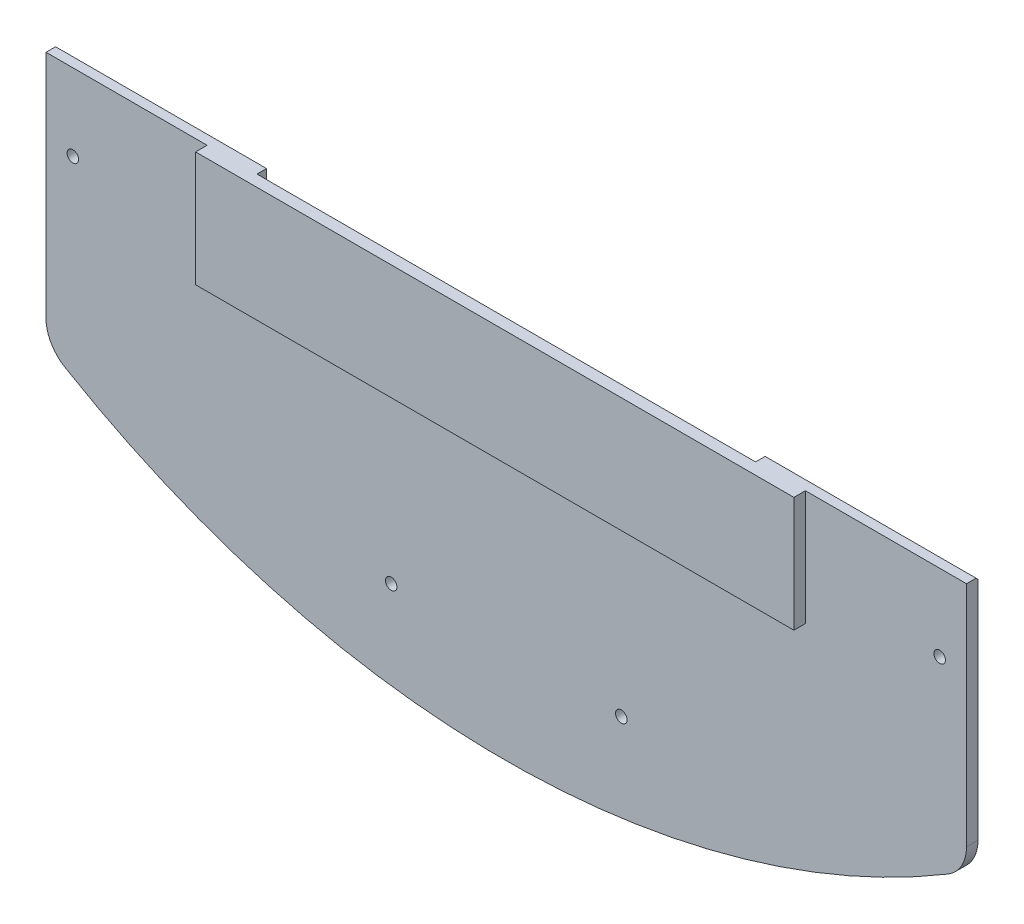
ISO-10303-21;
HEADER;
FILE_DESCRIPTION(('STEP AP214'),'2;1');
FILE_NAME('part.step','',(''),(''),'','','');
FILE_SCHEMA(('AUTOMOTIVE_DESIGN { 1 0 10303 214 1 1 1 1 }'));
ENDSEC;
DATA;
#1=APPLICATION_CONTEXT('core data for automotive mechanical design processes');
#2=APPLICATION_PROTOCOL_DEFINITION('international standard','automotive_design',2000,#1);
#3=PRODUCT_CONTEXT('',#1,'mechanical');
#4=PRODUCT('Part','Part','',(#3));
#5=PRODUCT_RELATED_PRODUCT_CATEGORY('part','',(#4));
#6=PRODUCT_DEFINITION_FORMATION('','',#4);
#7=PRODUCT_DEFINITION_CONTEXT('part definition',#1,'design');
#8=PRODUCT_DEFINITION('design','',#6,#7);
#9=PRODUCT_DEFINITION_SHAPE('','',#8);
#10=(LENGTH_UNIT() NAMED_UNIT(*) SI_UNIT(.MILLI.,.METRE.));
#11=(NAMED_UNIT(*) PLANE_ANGLE_UNIT() SI_UNIT($,.RADIAN.));
#12=(NAMED_UNIT(*) SI_UNIT($,.STERADIAN.) SOLID_ANGLE_UNIT());
#13=UNCERTAINTY_MEASURE_WITH_UNIT(LENGTH_MEASURE(1.E-05),#10,'distance_accuracy_value','');
#14=(GEOMETRIC_REPRESENTATION_CONTEXT(3) GLOBAL_UNCERTAINTY_ASSIGNED_CONTEXT((#13)) GLOBAL_UNIT_ASSIGNED_CONTEXT((#10,
#11,#12)) REPRESENTATION_CONTEXT('',''));
#15=CARTESIAN_POINT('',(0.,0.,0.));
#16=DIRECTION('',(0.,0.,1.));
#17=DIRECTION('',(1.,0.,0.));
#18=AXIS2_PLACEMENT_3D('',#15,#16,#17);
#19=CARTESIAN_POINT('',(-120.,-25.,3.));
#20=DIRECTION('',(1.,0.,0.));
#21=DIRECTION('',(0.,1.,0.));
#22=AXIS2_PLACEMENT_3D('',#19,#20,#21);
#23=PLANE('',#22);
#24=DIRECTION('',(0.,0.,-1.));
#25=VECTOR('',#24,1.);
#26=CARTESIAN_POINT('',(-120.,-25.,3.));
#27=LINE('',#26,#25);
#28=CARTESIAN_POINT('',(-120.,-25.,3.));
#29=VERTEX_POINT('',#28);
#30=CARTESIAN_POINT('',(-120.,-25.,0.500000000000028));
#31=VERTEX_POINT('',#30);
#32=EDGE_CURVE('E295',#29,#31,#27,.T.);
#33=ORIENTED_EDGE('',*,*,#32,.T.);
#34=DIRECTION('',(0.,0.707106781186543,0.707106781186553));
#35=VECTOR('',#34,1.);
#36=CARTESIAN_POINT('',(-120.,-25.,0.500000000000028));
#37=LINE('',#36,#35);
#38=CARTESIAN_POINT('',(-120.,-25.5,0.));
#39=VERTEX_POINT('',#38);
#40=EDGE_CURVE('E364',#31,#39,#37,.F.);
#41=ORIENTED_EDGE('',*,*,#40,.T.);
#42=DIRECTION('',(0.,-1.,0.));
#43=VECTOR('',#42,1.);
#44=CARTESIAN_POINT('',(-120.,-25.,0.));
#45=LINE('',#44,#43);
#46=CARTESIAN_POINT('',(-120.,-85.0406431127339,0.));
#47=VERTEX_POINT('',#46);
#48=EDGE_CURVE('E278',#39,#47,#45,.T.);
#49=ORIENTED_EDGE('',*,*,#48,.T.);
#50=DIRECTION('',(0.,0.,-1.));
#51=VECTOR('',#50,1.);
#52=CARTESIAN_POINT('',(-120.,-85.0406431127339,3.));
#53=LINE('',#52,#51);
#54=CARTESIAN_POINT('',(-120.,-85.0406431127339,3.));
#55=VERTEX_POINT('',#54);
#56=EDGE_CURVE('E336',#47,#55,#53,.F.);
#57=ORIENTED_EDGE('',*,*,#56,.T.);
#58=DIRECTION('',(0.,-1.,0.));
#59=VECTOR('',#58,1.);
#60=CARTESIAN_POINT('',(-120.,-25.,3.));
#61=LINE('',#60,#59);
#62=EDGE_CURVE('E279',#29,#55,#61,.T.);
#63=ORIENTED_EDGE('',*,*,#62,.F.);
#64=EDGE_LOOP('',(#33,#41,#49,#57,#63));
#65=FACE_BOUND('',#64,.T.);
#66=ADVANCED_FACE('F46',(#65),#23,.F.);
#67=CARTESIAN_POINT('',(-0.521854586070111,99.9986383296843,3.));
#68=DIRECTION('',(0.,0.,-1.));
#69=DIRECTION('',(-1.,0.,0.));
#70=AXIS2_PLACEMENT_3D('',#67,#68,#69);
#71=CYLINDRICAL_SURFACE('',#70,225.);
#72=CARTESIAN_POINT('',(-0.521854586070111,99.9986383296843,0.));
#73=DIRECTION('',(0.,0.,1.));
#74=DIRECTION('',(1.,0.,0.));
#75=AXIS2_PLACEMENT_3D('',#72,#73,#74);
#76=CIRCLE('',#75,225.);
#77=CARTESIAN_POINT('',(-115.092006763439,-93.647121319358,0.));
#78=VERTEX_POINT('',#77);
#79=CARTESIAN_POINT('',(115.140551376096,-92.9967187311607,0.));
#80=VERTEX_POINT('',#79);
#81=EDGE_CURVE('E298',#78,#80,#76,.T.);
#82=ORIENTED_EDGE('',*,*,#81,.T.);
#83=DIRECTION('',(0.,0.,-1.));
#84=VECTOR('',#83,1.);
#85=CARTESIAN_POINT('',(115.140551376096,-92.9967187311607,3.));
#86=LINE('',#85,#84);
#87=CARTESIAN_POINT('',(115.140551376096,-92.9967187311607,3.));
#88=VERTEX_POINT('',#87);
#89=EDGE_CURVE('E327',#80,#88,#86,.F.);
#90=ORIENTED_EDGE('',*,*,#89,.T.);
#91=CARTESIAN_POINT('',(-0.521854586070111,99.9986383296843,3.));
#92=DIRECTION('',(0.,0.,1.));
#93=DIRECTION('',(1.,0.,0.));
#94=AXIS2_PLACEMENT_3D('',#91,#92,#93);
#95=CIRCLE('',#94,225.);
#96=CARTESIAN_POINT('',(-115.092006763439,-93.647121319358,3.));
#97=VERTEX_POINT('',#96);
#98=EDGE_CURVE('E283',#97,#88,#95,.T.);
#99=ORIENTED_EDGE('',*,*,#98,.F.);
#100=DIRECTION('',(0.,0.,-1.));
#101=VECTOR('',#100,1.);
#102=CARTESIAN_POINT('',(-115.092006763439,-93.647121319358,3.));
#103=LINE('',#102,#101);
#104=EDGE_CURVE('E323',#97,#78,#103,.T.);
#105=ORIENTED_EDGE('',*,*,#104,.T.);
#106=EDGE_LOOP('',(#82,#90,#99,#105));
#107=FACE_BOUND('',#106,.T.);
#108=ADVANCED_FACE('F440',(#107),#71,.T.);
#109=CARTESIAN_POINT('',(120.,-25.,3.));
#110=DIRECTION('',(-1.,0.,0.));
#111=DIRECTION('',(0.,-1.,0.));
#112=AXIS2_PLACEMENT_3D('',#109,#110,#111);
#113=PLANE('',#112);
#114=DIRECTION('',(0.,1.,0.));
#115=VECTOR('',#114,1.);
#116=CARTESIAN_POINT('',(120.,-25.,0.));
#117=LINE('',#116,#115);
#118=CARTESIAN_POINT('',(120.,-84.4191473062342,0.));
#119=VERTEX_POINT('',#118);
#120=CARTESIAN_POINT('',(120.,-25.5,0.));
#121=VERTEX_POINT('',#120);
#122=EDGE_CURVE('E284',#119,#121,#117,.T.);
#123=ORIENTED_EDGE('',*,*,#122,.T.);
#124=DIRECTION('',(0.,-0.707106781186543,-0.707106781186553));
#125=VECTOR('',#124,1.);
#126=CARTESIAN_POINT('',(120.,-25.,0.500000000000054));
#127=LINE('',#126,#125);
#128=CARTESIAN_POINT('',(120.,-25.,0.500000000000028));
#129=VERTEX_POINT('',#128);
#130=EDGE_CURVE('E361',#121,#129,#127,.F.);
#131=ORIENTED_EDGE('',*,*,#130,.T.);
#132=DIRECTION('',(0.,0.,-1.));
#133=VECTOR('',#132,1.);
#134=CARTESIAN_POINT('',(120.,-25.,3.));
#135=LINE('',#134,#133);
#136=CARTESIAN_POINT('',(120.,-25.,3.));
#137=VERTEX_POINT('',#136);
#138=EDGE_CURVE('E308',#137,#129,#135,.T.);
#139=ORIENTED_EDGE('',*,*,#138,.F.);
#140=DIRECTION('',(0.,1.,0.));
#141=VECTOR('',#140,1.);
#142=CARTESIAN_POINT('',(120.,-25.,3.));
#143=LINE('',#142,#141);
#144=CARTESIAN_POINT('',(120.,-84.4191473062342,3.));
#145=VERTEX_POINT('',#144);
#146=EDGE_CURVE('E288',#145,#137,#143,.T.);
#147=ORIENTED_EDGE('',*,*,#146,.F.);
#148=DIRECTION('',(0.,0.,-1.));
#149=VECTOR('',#148,1.);
#150=CARTESIAN_POINT('',(120.,-84.4191473062342,3.));
#151=LINE('',#150,#149);
#152=EDGE_CURVE('E312',#145,#119,#151,.T.);
#153=ORIENTED_EDGE('',*,*,#152,.T.);
#154=EDGE_LOOP('',(#123,#131,#139,#147,#153));
#155=FACE_BOUND('',#154,.T.);
#156=ADVANCED_FACE('F447',(#155),#113,.F.);
#157=CARTESIAN_POINT('',(-120.,-25.,3.));
#158=DIRECTION('',(0.,-1.,0.));
#159=DIRECTION('',(0.,0.,-1.));
#160=AXIS2_PLACEMENT_3D('',#157,#158,#159);
#161=PLANE('',#160);
#162=ORIENTED_EDGE('',*,*,#138,.T.);
#163=DIRECTION('',(-1.,0.,0.));
#164=VECTOR('',#163,1.);
#165=CARTESIAN_POINT('',(-120.,-25.,0.500000000000028));
#166=LINE('',#165,#164);
#167=CARTESIAN_POINT('',(65.,-25.,0.500000000000028));
#168=VERTEX_POINT('',#167);
#169=EDGE_CURVE('E342',#129,#168,#166,.T.);
#170=ORIENTED_EDGE('',*,*,#169,.T.);
#171=DIRECTION('',(0.,0.,-1.));
#172=VECTOR('',#171,1.);
#173=CARTESIAN_POINT('',(65.,-25.,3.));
#174=LINE('',#173,#172);
#175=CARTESIAN_POINT('',(65.,-25.,3.));
#176=VERTEX_POINT('',#175);
#177=EDGE_CURVE('E196',#176,#168,#174,.T.);
#178=ORIENTED_EDGE('',*,*,#177,.F.);
#179=DIRECTION('',(1.,0.,0.));
#180=VECTOR('',#179,1.);
#181=CARTESIAN_POINT('',(65.,-25.,3.));
#182=LINE('',#181,#180);
#183=CARTESIAN_POINT('',(-65.,-25.,3.));
#184=VERTEX_POINT('',#183);
#185=EDGE_CURVE('E172',#184,#176,#182,.T.);
#186=ORIENTED_EDGE('',*,*,#185,.F.);
#187=DIRECTION('',(0.,0.,-1.));
#188=VECTOR('',#187,1.);
#189=CARTESIAN_POINT('',(-65.,-25.,3.));
#190=LINE('',#189,#188);
#191=CARTESIAN_POINT('',(-65.,-25.,0.500000000000028));
#192=VERTEX_POINT('',#191);
#193=EDGE_CURVE('E200',#184,#192,#190,.T.);
#194=ORIENTED_EDGE('',*,*,#193,.T.);
#195=DIRECTION('',(-1.,0.,0.));
#196=VECTOR('',#195,1.);
#197=CARTESIAN_POINT('',(-120.,-25.,0.500000000000028));
#198=LINE('',#197,#196);
#199=EDGE_CURVE('E339',#192,#31,#198,.T.);
#200=ORIENTED_EDGE('',*,*,#199,.T.);
#201=ORIENTED_EDGE('',*,*,#32,.F.);
#202=DIRECTION('',(-1.,0.,0.));
#203=VECTOR('',#202,1.);
#204=CARTESIAN_POINT('',(-120.,-25.,3.));
#205=LINE('',#204,#203);
#206=CARTESIAN_POINT('',(-78.,-25.,3.));
#207=VERTEX_POINT('',#206);
#208=EDGE_CURVE('E291',#207,#29,#205,.T.);
#209=ORIENTED_EDGE('',*,*,#208,.F.);
#210=DIRECTION('',(0.,0.,-1.));
#211=VECTOR('',#210,1.);
#212=CARTESIAN_POINT('',(-78.,-25.,6.));
#213=LINE('',#212,#211);
#214=CARTESIAN_POINT('',(-78.,-25.,6.));
#215=VERTEX_POINT('',#214);
#216=EDGE_CURVE('E252',#215,#207,#213,.T.);
#217=ORIENTED_EDGE('',*,*,#216,.F.);
#218=DIRECTION('',(-1.,0.,0.));
#219=VECTOR('',#218,1.);
#220=CARTESIAN_POINT('',(-78.,-25.,6.));
#221=LINE('',#220,#219);
#222=CARTESIAN_POINT('',(78.,-25.,6.));
#223=VERTEX_POINT('',#222);
#224=EDGE_CURVE('E249',#223,#215,#221,.T.);
#225=ORIENTED_EDGE('',*,*,#224,.F.);
#226=DIRECTION('',(0.,0.,-1.));
#227=VECTOR('',#226,1.);
#228=CARTESIAN_POINT('',(78.,-25.,6.));
#229=LINE('',#228,#227);
#230=CARTESIAN_POINT('',(78.,-25.,3.));
#231=VERTEX_POINT('',#230);
#232=EDGE_CURVE('E266',#223,#231,#229,.T.);
#233=ORIENTED_EDGE('',*,*,#232,.T.);
#234=EDGE_CURVE('E292',#137,#231,#205,.T.);
#235=ORIENTED_EDGE('',*,*,#234,.F.);
#236=EDGE_LOOP('',(#162,#170,#178,#186,#194,#200,#201,#209,#217,#225,#233,#235));
#237=FACE_BOUND('',#236,.T.);
#238=ADVANCED_FACE('F394',(#237),#161,.F.);
#239=CARTESIAN_POINT('',(-0.521854586070111,99.9986383296843,3.));
#240=DIRECTION('',(0.,0.,1.));
#241=DIRECTION('',(1.,0.,0.));
#242=AXIS2_PLACEMENT_3D('',#239,#240,#241);
#243=PLANE('',#242);
#244=CARTESIAN_POINT('',(30.,-100.,3.));
#245=DIRECTION('',(0.,0.,-1.));
#246=DIRECTION('',(1.,0.,0.));
#247=AXIS2_PLACEMENT_3D('',#244,#245,#246);
#248=CIRCLE('',#247,1.5);
#249=CARTESIAN_POINT('',(31.5,-100.,3.));
#250=VERTEX_POINT('',#249);
#251=EDGE_CURVE('E199',#250,#250,#248,.T.);
#252=ORIENTED_EDGE('',*,*,#251,.T.);
#253=EDGE_LOOP('',(#252));
#254=FACE_BOUND('',#253,.T.);
#255=CARTESIAN_POINT('',(113.,-45.,3.));
#256=DIRECTION('',(0.,0.,-1.));
#257=DIRECTION('',(1.,0.,0.));
#258=AXIS2_PLACEMENT_3D('',#255,#256,#257);
#259=CIRCLE('',#258,1.5);
#260=CARTESIAN_POINT('',(114.5,-45.,3.));
#261=VERTEX_POINT('',#260);
#262=EDGE_CURVE('E219',#261,#261,#259,.T.);
#263=ORIENTED_EDGE('',*,*,#262,.T.);
#264=EDGE_LOOP('',(#263));
#265=FACE_BOUND('',#264,.T.);
#266=CARTESIAN_POINT('',(-113.,-45.,3.));
#267=DIRECTION('',(0.,0.,-1.));
#268=DIRECTION('',(-1.,0.,0.));
#269=AXIS2_PLACEMENT_3D('',#266,#267,#268);
#270=CIRCLE('',#269,1.5);
#271=CARTESIAN_POINT('',(-114.5,-45.,3.));
#272=VERTEX_POINT('',#271);
#273=EDGE_CURVE('E211',#272,#272,#270,.T.);
#274=ORIENTED_EDGE('',*,*,#273,.T.);
#275=EDGE_LOOP('',(#274));
#276=FACE_BOUND('',#275,.T.);
#277=CARTESIAN_POINT('',(-30.,-100.,3.));
#278=DIRECTION('',(0.,0.,-1.));
#279=DIRECTION('',(-1.,0.,0.));
#280=AXIS2_PLACEMENT_3D('',#277,#278,#279);
#281=CIRCLE('',#280,1.50000000000001);
#282=CARTESIAN_POINT('',(-31.5,-100.,3.));
#283=VERTEX_POINT('',#282);
#284=EDGE_CURVE('E230',#283,#283,#281,.T.);
#285=ORIENTED_EDGE('',*,*,#284,.T.);
#286=EDGE_LOOP('',(#285));
#287=FACE_BOUND('',#286,.T.);
#288=ORIENTED_EDGE('',*,*,#98,.T.);
#289=CARTESIAN_POINT('',(110.,-84.4191473062342,3.));
#290=DIRECTION('',(0.,0.,1.));
#291=DIRECTION('',(1.,0.,0.));
#292=AXIS2_PLACEMENT_3D('',#289,#290,#291);
#293=CIRCLE('',#292,10.);
#294=EDGE_CURVE('E333',#88,#145,#293,.T.);
#295=ORIENTED_EDGE('',*,*,#294,.T.);
#296=ORIENTED_EDGE('',*,*,#146,.T.);
#297=ORIENTED_EDGE('',*,*,#234,.T.);
#298=DIRECTION('',(0.,1.,0.));
#299=VECTOR('',#298,1.);
#300=CARTESIAN_POINT('',(78.,-25.,3.));
#301=LINE('',#300,#299);
#302=CARTESIAN_POINT('',(78.,-55.,3.));
#303=VERTEX_POINT('',#302);
#304=EDGE_CURVE('E243',#303,#231,#301,.T.);
#305=ORIENTED_EDGE('',*,*,#304,.F.);
#306=DIRECTION('',(1.,0.,0.));
#307=VECTOR('',#306,1.);
#308=CARTESIAN_POINT('',(-78.,-55.,3.));
#309=LINE('',#308,#307);
#310=CARTESIAN_POINT('',(-78.,-55.,3.));
#311=VERTEX_POINT('',#310);
#312=EDGE_CURVE('E256',#311,#303,#309,.T.);
#313=ORIENTED_EDGE('',*,*,#312,.F.);
#314=DIRECTION('',(0.,-1.,0.));
#315=VECTOR('',#314,1.);
#316=CARTESIAN_POINT('',(-78.,-25.,3.));
#317=LINE('',#316,#315);
#318=EDGE_CURVE('E234',#207,#311,#317,.T.);
#319=ORIENTED_EDGE('',*,*,#318,.F.);
#320=ORIENTED_EDGE('',*,*,#208,.T.);
#321=ORIENTED_EDGE('',*,*,#62,.T.);
#322=CARTESIAN_POINT('',(-110.,-85.0406431127339,3.));
#323=DIRECTION('',(0.,0.,1.));
#324=DIRECTION('',(1.,0.,0.));
#325=AXIS2_PLACEMENT_3D('',#322,#323,#324);
#326=CIRCLE('',#325,10.);
#327=EDGE_CURVE('E330',#55,#97,#326,.T.);
#328=ORIENTED_EDGE('',*,*,#327,.T.);
#329=EDGE_LOOP('',(#288,#295,#296,#297,#305,#313,#319,#320,#321,#328));
#330=FACE_BOUND('',#329,.T.);
#331=ADVANCED_FACE('F411',(#254,#265,#276,#287,#330),#243,.T.);
#332=CARTESIAN_POINT('',(-0.521854586070111,99.9986383296843,0.));
#333=DIRECTION('',(0.,0.,1.));
#334=DIRECTION('',(1.,0.,0.));
#335=AXIS2_PLACEMENT_3D('',#332,#333,#334);
#336=PLANE('',#335);
#337=CARTESIAN_POINT('',(30.,-100.,0.));
#338=DIRECTION('',(0.,0.,-1.));
#339=DIRECTION('',(1.,0.,0.));
#340=AXIS2_PLACEMENT_3D('',#337,#338,#339);
#341=CIRCLE('',#340,1.5);
#342=CARTESIAN_POINT('',(31.5,-100.,0.));
#343=VERTEX_POINT('',#342);
#344=EDGE_CURVE('E223',#343,#343,#341,.T.);
#345=ORIENTED_EDGE('',*,*,#344,.F.);
#346=EDGE_LOOP('',(#345));
#347=FACE_BOUND('',#346,.T.);
#348=CARTESIAN_POINT('',(113.,-45.,0.));
#349=DIRECTION('',(0.,0.,-1.));
#350=DIRECTION('',(1.,0.,0.));
#351=AXIS2_PLACEMENT_3D('',#348,#349,#350);
#352=CIRCLE('',#351,1.5);
#353=CARTESIAN_POINT('',(114.5,-45.,0.));
#354=VERTEX_POINT('',#353);
#355=EDGE_CURVE('E215',#354,#354,#352,.T.);
#356=ORIENTED_EDGE('',*,*,#355,.F.);
#357=EDGE_LOOP('',(#356));
#358=FACE_BOUND('',#357,.T.);
#359=CARTESIAN_POINT('',(-113.,-45.,0.));
#360=DIRECTION('',(0.,0.,-1.));
#361=DIRECTION('',(-1.,0.,0.));
#362=AXIS2_PLACEMENT_3D('',#359,#360,#361);
#363=CIRCLE('',#362,1.5);
#364=CARTESIAN_POINT('',(-114.5,-45.,0.));
#365=VERTEX_POINT('',#364);
#366=EDGE_CURVE('E206',#365,#365,#363,.T.);
#367=ORIENTED_EDGE('',*,*,#366,.F.);
#368=EDGE_LOOP('',(#367));
#369=FACE_BOUND('',#368,.T.);
#370=CARTESIAN_POINT('',(-30.,-100.,0.));
#371=DIRECTION('',(0.,0.,-1.));
#372=DIRECTION('',(-1.,0.,0.));
#373=AXIS2_PLACEMENT_3D('',#370,#371,#372);
#374=CIRCLE('',#373,1.50000000000001);
#375=CARTESIAN_POINT('',(-31.5,-100.,0.));
#376=VERTEX_POINT('',#375);
#377=EDGE_CURVE('E210',#376,#376,#374,.T.);
#378=ORIENTED_EDGE('',*,*,#377,.F.);
#379=EDGE_LOOP('',(#378));
#380=FACE_BOUND('',#379,.T.);
#381=DIRECTION('',(0.,1.,0.));
#382=VECTOR('',#381,1.);
#383=CARTESIAN_POINT('',(65.5,99.9986383296843,0.));
#384=LINE('',#383,#382);
#385=CARTESIAN_POINT('',(65.5,-45.5,0.));
#386=VERTEX_POINT('',#385);
#387=CARTESIAN_POINT('',(65.5,-25.5,0.));
#388=VERTEX_POINT('',#387);
#389=EDGE_CURVE('E349',#386,#388,#384,.T.);
#390=ORIENTED_EDGE('',*,*,#389,.T.);
#391=DIRECTION('',(1.,0.,0.));
#392=VECTOR('',#391,1.);
#393=CARTESIAN_POINT('',(-0.521854586070111,-25.5,0.));
#394=LINE('',#393,#392);
#395=EDGE_CURVE('E358',#388,#121,#394,.T.);
#396=ORIENTED_EDGE('',*,*,#395,.T.);
#397=ORIENTED_EDGE('',*,*,#122,.F.);
#398=CARTESIAN_POINT('',(110.,-84.4191473062342,0.));
#399=DIRECTION('',(0.,0.,1.));
#400=DIRECTION('',(1.,0.,0.));
#401=AXIS2_PLACEMENT_3D('',#398,#399,#400);
#402=CIRCLE('',#401,10.);
#403=EDGE_CURVE('E320',#119,#80,#402,.F.);
#404=ORIENTED_EDGE('',*,*,#403,.T.);
#405=ORIENTED_EDGE('',*,*,#81,.F.);
#406=CARTESIAN_POINT('',(-110.,-85.0406431127339,0.));
#407=DIRECTION('',(0.,0.,1.));
#408=DIRECTION('',(1.,0.,0.));
#409=AXIS2_PLACEMENT_3D('',#406,#407,#408);
#410=CIRCLE('',#409,10.);
#411=EDGE_CURVE('E316',#78,#47,#410,.F.);
#412=ORIENTED_EDGE('',*,*,#411,.T.);
#413=ORIENTED_EDGE('',*,*,#48,.F.);
#414=DIRECTION('',(1.,0.,0.));
#415=VECTOR('',#414,1.);
#416=CARTESIAN_POINT('',(-0.521854586070111,-25.5,0.));
#417=LINE('',#416,#415);
#418=CARTESIAN_POINT('',(-65.5,-25.5,0.));
#419=VERTEX_POINT('',#418);
#420=EDGE_CURVE('E355',#39,#419,#417,.T.);
#421=ORIENTED_EDGE('',*,*,#420,.T.);
#422=DIRECTION('',(0.,-1.,0.));
#423=VECTOR('',#422,1.);
#424=CARTESIAN_POINT('',(-65.5000000000001,99.9986383296842,0.));
#425=LINE('',#424,#423);
#426=CARTESIAN_POINT('',(-65.5,-45.5,0.));
#427=VERTEX_POINT('',#426);
#428=EDGE_CURVE('E352',#419,#427,#425,.T.);
#429=ORIENTED_EDGE('',*,*,#428,.T.);
#430=DIRECTION('',(1.,0.,0.));
#431=VECTOR('',#430,1.);
#432=CARTESIAN_POINT('',(-0.521854586070111,-45.5,0.));
#433=LINE('',#432,#431);
#434=EDGE_CURVE('E346',#427,#386,#433,.T.);
#435=ORIENTED_EDGE('',*,*,#434,.T.);
#436=EDGE_LOOP('',(#390,#396,#397,#404,#405,#412,#413,#421,#429,#435));
#437=FACE_BOUND('',#436,.T.);
#438=ADVANCED_FACE('F403',(#347,#358,#369,#380,#437),#336,.F.);
#439=CARTESIAN_POINT('',(-78.,-25.,6.));
#440=DIRECTION('',(1.,0.,0.));
#441=DIRECTION('',(0.,0.,-1.));
#442=AXIS2_PLACEMENT_3D('',#439,#440,#441);
#443=PLANE('',#442);
#444=ORIENTED_EDGE('',*,*,#318,.T.);
#445=DIRECTION('',(0.,0.,-1.));
#446=VECTOR('',#445,1.);
#447=CARTESIAN_POINT('',(-78.,-55.,6.));
#448=LINE('',#447,#446);
#449=CARTESIAN_POINT('',(-78.,-55.,6.));
#450=VERTEX_POINT('',#449);
#451=EDGE_CURVE('E274',#450,#311,#448,.T.);
#452=ORIENTED_EDGE('',*,*,#451,.F.);
#453=DIRECTION('',(0.,-1.,0.));
#454=VECTOR('',#453,1.);
#455=CARTESIAN_POINT('',(-78.,-25.,6.));
#456=LINE('',#455,#454);
#457=EDGE_CURVE('E238',#215,#450,#456,.T.);
#458=ORIENTED_EDGE('',*,*,#457,.F.);
#459=ORIENTED_EDGE('',*,*,#216,.T.);
#460=EDGE_LOOP('',(#444,#452,#458,#459));
#461=FACE_BOUND('',#460,.T.);
#462=ADVANCED_FACE('F419',(#461),#443,.F.);
#463=CARTESIAN_POINT('',(-78.,-55.,6.));
#464=DIRECTION('',(0.,1.,0.));
#465=DIRECTION('',(0.,0.,1.));
#466=AXIS2_PLACEMENT_3D('',#463,#464,#465);
#467=PLANE('',#466);
#468=ORIENTED_EDGE('',*,*,#312,.T.);
#469=DIRECTION('',(0.,0.,-1.));
#470=VECTOR('',#469,1.);
#471=CARTESIAN_POINT('',(78.,-55.,6.));
#472=LINE('',#471,#470);
#473=CARTESIAN_POINT('',(78.,-55.,6.));
#474=VERTEX_POINT('',#473);
#475=EDGE_CURVE('E270',#474,#303,#472,.T.);
#476=ORIENTED_EDGE('',*,*,#475,.F.);
#477=DIRECTION('',(1.,0.,0.));
#478=VECTOR('',#477,1.);
#479=CARTESIAN_POINT('',(-78.,-55.,6.));
#480=LINE('',#479,#478);
#481=EDGE_CURVE('E242',#450,#474,#480,.T.);
#482=ORIENTED_EDGE('',*,*,#481,.F.);
#483=ORIENTED_EDGE('',*,*,#451,.T.);
#484=EDGE_LOOP('',(#468,#476,#482,#483));
#485=FACE_BOUND('',#484,.T.);
#486=ADVANCED_FACE('F430',(#485),#467,.F.);
#487=CARTESIAN_POINT('',(78.,-25.,6.));
#488=DIRECTION('',(-1.,0.,0.));
#489=DIRECTION('',(0.,-1.,0.));
#490=AXIS2_PLACEMENT_3D('',#487,#488,#489);
#491=PLANE('',#490);
#492=ORIENTED_EDGE('',*,*,#304,.T.);
#493=ORIENTED_EDGE('',*,*,#232,.F.);
#494=DIRECTION('',(0.,1.,0.));
#495=VECTOR('',#494,1.);
#496=CARTESIAN_POINT('',(78.,-25.,6.));
#497=LINE('',#496,#495);
#498=EDGE_CURVE('E246',#474,#223,#497,.T.);
#499=ORIENTED_EDGE('',*,*,#498,.F.);
#500=ORIENTED_EDGE('',*,*,#475,.T.);
#501=EDGE_LOOP('',(#492,#493,#499,#500));
#502=FACE_BOUND('',#501,.T.);
#503=ADVANCED_FACE('F428',(#502),#491,.F.);
#504=CARTESIAN_POINT('',(0.,0.,6.));
#505=DIRECTION('',(0.,0.,1.));
#506=DIRECTION('',(1.,0.,0.));
#507=AXIS2_PLACEMENT_3D('',#504,#505,#506);
#508=PLANE('',#507);
#509=ORIENTED_EDGE('',*,*,#457,.T.);
#510=ORIENTED_EDGE('',*,*,#481,.T.);
#511=ORIENTED_EDGE('',*,*,#498,.T.);
#512=ORIENTED_EDGE('',*,*,#224,.T.);
#513=EDGE_LOOP('',(#509,#510,#511,#512));
#514=FACE_BOUND('',#513,.T.);
#515=ADVANCED_FACE('F422',(#514),#508,.T.);
#516=CARTESIAN_POINT('',(-30.,-100.,3.));
#517=DIRECTION('',(0.,0.,-1.));
#518=DIRECTION('',(-1.,0.,0.));
#519=AXIS2_PLACEMENT_3D('',#516,#517,#518);
#520=CYLINDRICAL_SURFACE('',#519,1.50000000000001);
#521=ORIENTED_EDGE('',*,*,#284,.F.);
#522=EDGE_LOOP('',(#521));
#523=FACE_BOUND('',#522,.T.);
#524=ORIENTED_EDGE('',*,*,#377,.T.);
#525=EDGE_LOOP('',(#524));
#526=FACE_BOUND('',#525,.T.);
#527=ADVANCED_FACE('F618',(#523,#526),#520,.F.);
#528=CARTESIAN_POINT('',(-113.,-45.,3.));
#529=DIRECTION('',(0.,0.,-1.));
#530=DIRECTION('',(-1.,0.,0.));
#531=AXIS2_PLACEMENT_3D('',#528,#529,#530);
#532=CYLINDRICAL_SURFACE('',#531,1.5);
#533=ORIENTED_EDGE('',*,*,#273,.F.);
#534=EDGE_LOOP('',(#533));
#535=FACE_BOUND('',#534,.T.);
#536=ORIENTED_EDGE('',*,*,#366,.T.);
#537=EDGE_LOOP('',(#536));
#538=FACE_BOUND('',#537,.T.);
#539=ADVANCED_FACE('F609',(#535,#538),#532,.F.);
#540=CARTESIAN_POINT('',(113.,-45.,3.));
#541=DIRECTION('',(0.,0.,-1.));
#542=DIRECTION('',(-1.,0.,0.));
#543=AXIS2_PLACEMENT_3D('',#540,#541,#542);
#544=CYLINDRICAL_SURFACE('',#543,1.5);
#545=ORIENTED_EDGE('',*,*,#262,.F.);
#546=EDGE_LOOP('',(#545));
#547=FACE_BOUND('',#546,.T.);
#548=ORIENTED_EDGE('',*,*,#355,.T.);
#549=EDGE_LOOP('',(#548));
#550=FACE_BOUND('',#549,.T.);
#551=ADVANCED_FACE('F600',(#547,#550),#544,.F.);
#552=CARTESIAN_POINT('',(30.,-100.,3.));
#553=DIRECTION('',(0.,0.,-1.));
#554=DIRECTION('',(-1.,0.,0.));
#555=AXIS2_PLACEMENT_3D('',#552,#553,#554);
#556=CYLINDRICAL_SURFACE('',#555,1.5);
#557=ORIENTED_EDGE('',*,*,#251,.F.);
#558=EDGE_LOOP('',(#557));
#559=FACE_BOUND('',#558,.T.);
#560=ORIENTED_EDGE('',*,*,#344,.T.);
#561=EDGE_LOOP('',(#560));
#562=FACE_BOUND('',#561,.T.);
#563=ADVANCED_FACE('F507',(#559,#562),#556,.F.);
#564=CARTESIAN_POINT('',(65.,-25.,3.));
#565=DIRECTION('',(1.,0.,0.));
#566=DIRECTION('',(0.,0.,-1.));
#567=AXIS2_PLACEMENT_3D('',#564,#565,#566);
#568=PLANE('',#567);
#569=ORIENTED_EDGE('',*,*,#177,.T.);
#570=DIRECTION('',(0.,-1.,0.));
#571=VECTOR('',#570,1.);
#572=CARTESIAN_POINT('',(65.,-25.,0.500000000000028));
#573=LINE('',#572,#571);
#574=CARTESIAN_POINT('',(65.,-45.,0.500000000000028));
#575=VERTEX_POINT('',#574);
#576=EDGE_CURVE('E57',#168,#575,#573,.T.);
#577=ORIENTED_EDGE('',*,*,#576,.T.);
#578=DIRECTION('',(0.,0.,-1.));
#579=VECTOR('',#578,1.);
#580=CARTESIAN_POINT('',(65.,-45.,3.));
#581=LINE('',#580,#579);
#582=CARTESIAN_POINT('',(65.,-45.,3.));
#583=VERTEX_POINT('',#582);
#584=EDGE_CURVE('E164',#583,#575,#581,.T.);
#585=ORIENTED_EDGE('',*,*,#584,.F.);
#586=DIRECTION('',(0.,-1.,0.));
#587=VECTOR('',#586,1.);
#588=CARTESIAN_POINT('',(65.,-25.,3.));
#589=LINE('',#588,#587);
#590=EDGE_CURVE('E168',#176,#583,#589,.T.);
#591=ORIENTED_EDGE('',*,*,#590,.F.);
#592=EDGE_LOOP('',(#569,#577,#585,#591));
#593=FACE_BOUND('',#592,.T.);
#594=ADVANCED_FACE('F166',(#593),#568,.F.);
#595=CARTESIAN_POINT('',(-65.,-25.,3.));
#596=DIRECTION('',(-1.,0.,0.));
#597=DIRECTION('',(0.,-1.,0.));
#598=AXIS2_PLACEMENT_3D('',#595,#596,#597);
#599=PLANE('',#598);
#600=DIRECTION('',(0.,0.,-1.));
#601=VECTOR('',#600,1.);
#602=CARTESIAN_POINT('',(-65.,-45.,3.));
#603=LINE('',#602,#601);
#604=CARTESIAN_POINT('',(-65.,-45.,3.));
#605=VERTEX_POINT('',#604);
#606=CARTESIAN_POINT('',(-65.,-45.,0.500000000000028));
#607=VERTEX_POINT('',#606);
#608=EDGE_CURVE('E171',#605,#607,#603,.T.);
#609=ORIENTED_EDGE('',*,*,#608,.T.);
#610=DIRECTION('',(0.,1.,0.));
#611=VECTOR('',#610,1.);
#612=CARTESIAN_POINT('',(-65.,-25.,0.500000000000028));
#613=LINE('',#612,#611);
#614=EDGE_CURVE('E367',#607,#192,#613,.T.);
#615=ORIENTED_EDGE('',*,*,#614,.T.);
#616=ORIENTED_EDGE('',*,*,#193,.F.);
#617=DIRECTION('',(0.,1.,0.));
#618=VECTOR('',#617,1.);
#619=CARTESIAN_POINT('',(-65.,-25.,3.));
#620=LINE('',#619,#618);
#621=EDGE_CURVE('E181',#605,#184,#620,.T.);
#622=ORIENTED_EDGE('',*,*,#621,.F.);
#623=EDGE_LOOP('',(#609,#615,#616,#622));
#624=FACE_BOUND('',#623,.T.);
#625=ADVANCED_FACE('F391',(#624),#599,.F.);
#626=CARTESIAN_POINT('',(65.,-45.,3.));
#627=DIRECTION('',(0.,-1.,0.));
#628=DIRECTION('',(0.,0.,-1.));
#629=AXIS2_PLACEMENT_3D('',#626,#627,#628);
#630=PLANE('',#629);
#631=ORIENTED_EDGE('',*,*,#584,.T.);
#632=DIRECTION('',(-1.,0.,0.));
#633=VECTOR('',#632,1.);
#634=CARTESIAN_POINT('',(65.,-45.,0.500000000000028));
#635=LINE('',#634,#633);
#636=EDGE_CURVE('E11',#575,#607,#635,.T.);
#637=ORIENTED_EDGE('',*,*,#636,.T.);
#638=ORIENTED_EDGE('',*,*,#608,.F.);
#639=DIRECTION('',(-1.,0.,0.));
#640=VECTOR('',#639,1.);
#641=CARTESIAN_POINT('',(65.,-45.,3.));
#642=LINE('',#641,#640);
#643=EDGE_CURVE('E175',#583,#605,#642,.T.);
#644=ORIENTED_EDGE('',*,*,#643,.F.);
#645=EDGE_LOOP('',(#631,#637,#638,#644));
#646=FACE_BOUND('',#645,.T.);
#647=ADVANCED_FACE('F176',(#646),#630,.F.);
#648=CARTESIAN_POINT('',(0.,0.,3.));
#649=DIRECTION('',(0.,0.,-1.));
#650=DIRECTION('',(-1.,0.,0.));
#651=AXIS2_PLACEMENT_3D('',#648,#649,#650);
#652=PLANE('',#651);
#653=ORIENTED_EDGE('',*,*,#590,.T.);
#654=ORIENTED_EDGE('',*,*,#643,.T.);
#655=ORIENTED_EDGE('',*,*,#621,.T.);
#656=ORIENTED_EDGE('',*,*,#185,.T.);
#657=EDGE_LOOP('',(#653,#654,#655,#656));
#658=FACE_BOUND('',#657,.T.);
#659=ADVANCED_FACE('F183',(#658),#652,.T.);
#660=CARTESIAN_POINT('',(110.,-84.4191473062342,3.));
#661=DIRECTION('',(0.,0.,-1.));
#662=DIRECTION('',(-1.,0.,0.));
#663=AXIS2_PLACEMENT_3D('',#660,#661,#662);
#664=CYLINDRICAL_SURFACE('',#663,10.);
#665=ORIENTED_EDGE('',*,*,#294,.F.);
#666=ORIENTED_EDGE('',*,*,#89,.F.);
#667=ORIENTED_EDGE('',*,*,#403,.F.);
#668=ORIENTED_EDGE('',*,*,#152,.F.);
#669=EDGE_LOOP('',(#665,#666,#667,#668));
#670=FACE_BOUND('',#669,.T.);
#671=ADVANCED_FACE('F452',(#670),#664,.T.);
#672=CARTESIAN_POINT('',(-110.,-85.0406431127339,3.));
#673=DIRECTION('',(0.,0.,-1.));
#674=DIRECTION('',(-1.,0.,0.));
#675=AXIS2_PLACEMENT_3D('',#672,#673,#674);
#676=CYLINDRICAL_SURFACE('',#675,10.);
#677=ORIENTED_EDGE('',*,*,#327,.F.);
#678=ORIENTED_EDGE('',*,*,#56,.F.);
#679=ORIENTED_EDGE('',*,*,#411,.F.);
#680=ORIENTED_EDGE('',*,*,#104,.F.);
#681=EDGE_LOOP('',(#677,#678,#679,#680));
#682=FACE_BOUND('',#681,.T.);
#683=ADVANCED_FACE('F409',(#682),#676,.T.);
#684=CARTESIAN_POINT('',(-120.,-25.,0.500000000000028));
#685=DIRECTION('',(0.,-0.707106781186553,0.707106781186543));
#686=DIRECTION('',(-1.,0.,0.));
#687=AXIS2_PLACEMENT_3D('',#684,#685,#686);
#688=PLANE('',#687);
#689=ORIENTED_EDGE('',*,*,#40,.F.);
#690=ORIENTED_EDGE('',*,*,#199,.F.);
#691=DIRECTION('',(0.577350269189615,0.577350269189627,0.577350269189635));
#692=VECTOR('',#691,1.);
#693=CARTESIAN_POINT('',(-65.,-25.,0.500000000000028));
#694=LINE('',#693,#692);
#695=EDGE_CURVE('E51',#419,#192,#694,.T.);
#696=ORIENTED_EDGE('',*,*,#695,.F.);
#697=ORIENTED_EDGE('',*,*,#420,.F.);
#698=EDGE_LOOP('',(#689,#690,#696,#697));
#699=FACE_BOUND('',#698,.T.);
#700=ADVANCED_FACE('F49',(#699),#688,.F.);
#701=CARTESIAN_POINT('',(-65.,-25.,0.500000000000028));
#702=DIRECTION('',(-0.70710678118656,0.,0.707106781186535));
#703=DIRECTION('',(0.,1.,0.));
#704=AXIS2_PLACEMENT_3D('',#701,#702,#703);
#705=PLANE('',#704);
#706=ORIENTED_EDGE('',*,*,#695,.T.);
#707=ORIENTED_EDGE('',*,*,#614,.F.);
#708=DIRECTION('',(0.577350269189607,0.577350269189643,0.577350269189627));
#709=VECTOR('',#708,1.);
#710=CARTESIAN_POINT('',(-58.3333333333334,-38.3333333333329,7.16666666666691));
#711=LINE('',#710,#709);
#712=EDGE_CURVE('E190',#427,#607,#711,.T.);
#713=ORIENTED_EDGE('',*,*,#712,.F.);
#714=ORIENTED_EDGE('',*,*,#428,.F.);
#715=EDGE_LOOP('',(#706,#707,#713,#714));
#716=FACE_BOUND('',#715,.T.);
#717=ADVANCED_FACE('F388',(#716),#705,.F.);
#718=CARTESIAN_POINT('',(65.,-45.,0.500000000000028));
#719=DIRECTION('',(0.,-0.707106781186538,0.707106781186557));
#720=DIRECTION('',(-1.,0.,0.));
#721=AXIS2_PLACEMENT_3D('',#718,#719,#720);
#722=PLANE('',#721);
#723=ORIENTED_EDGE('',*,*,#712,.T.);
#724=ORIENTED_EDGE('',*,*,#636,.F.);
#725=DIRECTION('',(0.57735026918962,-0.577350269189636,-0.57735026918962));
#726=VECTOR('',#725,1.);
#727=CARTESIAN_POINT('',(58.3333333333333,-38.3333333333331,7.16666666666675));
#728=LINE('',#727,#726);
#729=EDGE_CURVE('E375',#386,#575,#728,.F.);
#730=ORIENTED_EDGE('',*,*,#729,.F.);
#731=ORIENTED_EDGE('',*,*,#434,.F.);
#732=EDGE_LOOP('',(#723,#724,#730,#731));
#733=FACE_BOUND('',#732,.T.);
#734=ADVANCED_FACE('F383',(#733),#722,.F.);
#735=CARTESIAN_POINT('',(65.,-25.,0.500000000000028));
#736=DIRECTION('',(0.707106781186548,0.,0.707106781186548));
#737=DIRECTION('',(0.,-1.,0.));
#738=AXIS2_PLACEMENT_3D('',#735,#736,#737);
#739=PLANE('',#738);
#740=ORIENTED_EDGE('',*,*,#729,.T.);
#741=ORIENTED_EDGE('',*,*,#576,.F.);
#742=DIRECTION('',(0.577350269189628,-0.57735026918962,-0.577350269189628));
#743=VECTOR('',#742,1.);
#744=CARTESIAN_POINT('',(65.,-25.,0.500000000000028));
#745=LINE('',#744,#743);
#746=EDGE_CURVE('E372',#388,#168,#745,.F.);
#747=ORIENTED_EDGE('',*,*,#746,.F.);
#748=ORIENTED_EDGE('',*,*,#389,.F.);
#749=EDGE_LOOP('',(#740,#741,#747,#748));
#750=FACE_BOUND('',#749,.T.);
#751=ADVANCED_FACE('F464',(#750),#739,.F.);
#752=CARTESIAN_POINT('',(-120.,-25.,0.500000000000028));
#753=DIRECTION('',(0.,-0.707106781186553,0.707106781186543));
#754=DIRECTION('',(-1.,0.,0.));
#755=AXIS2_PLACEMENT_3D('',#752,#753,#754);
#756=PLANE('',#755);
#757=ORIENTED_EDGE('',*,*,#130,.F.);
#758=ORIENTED_EDGE('',*,*,#395,.F.);
#759=ORIENTED_EDGE('',*,*,#746,.T.);
#760=ORIENTED_EDGE('',*,*,#169,.F.);
#761=EDGE_LOOP('',(#757,#758,#759,#760));
#762=FACE_BOUND('',#761,.T.);
#763=ADVANCED_FACE('F458',(#762),#756,.F.);
#764=CLOSED_SHELL('',(#66,#108,#156,#238,#331,#438,#462,#486,#503,#515,#527,#539,#551,#563,#594,
#625,#647,#659,#671,#683,#700,#717,#734,#751,#763));
#765=MANIFOLD_SOLID_BREP('B2',#764);
#766=ADVANCED_BREP_SHAPE_REPRESENTATION('',(#18,#765),#14);
#767=SHAPE_DEFINITION_REPRESENTATION(#9,#766);
ENDSEC;
END-ISO-10303-21;
